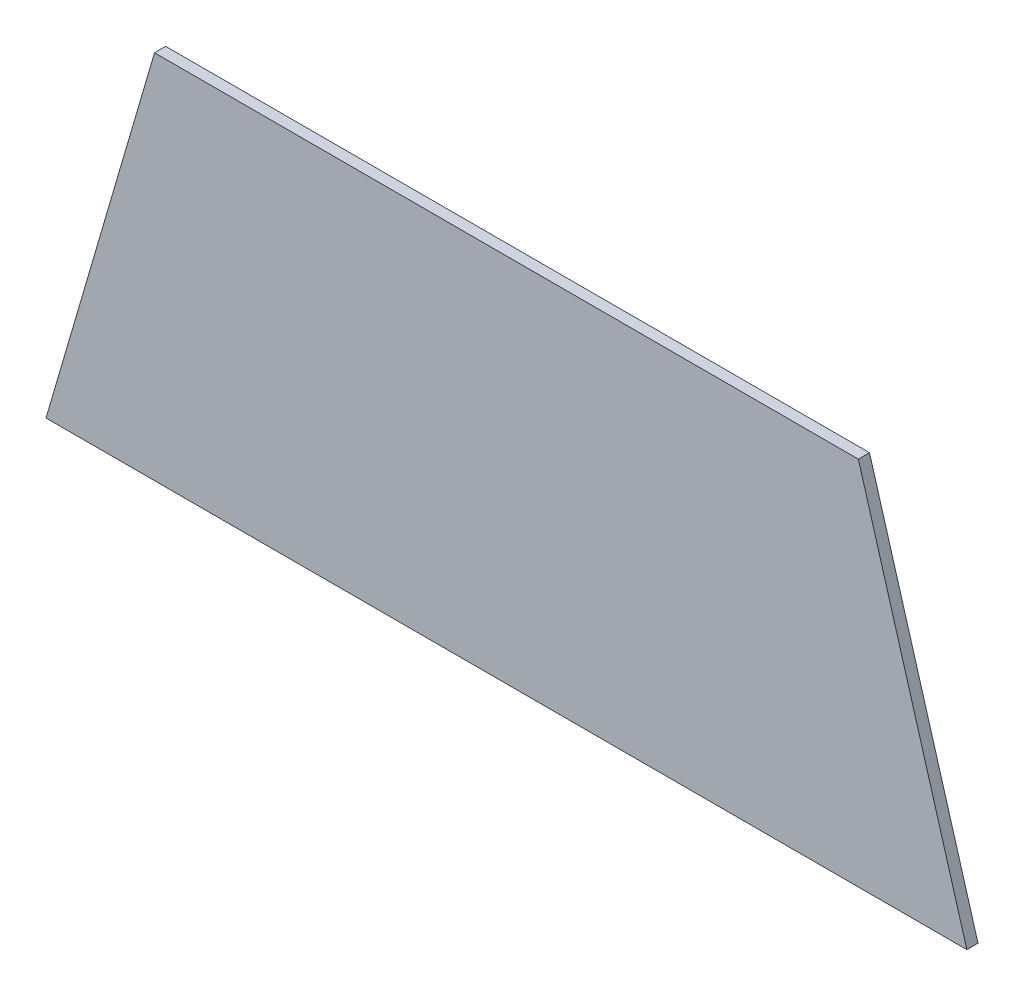
ISO-10303-21;
HEADER;
FILE_DESCRIPTION(('STEP AP214'),'2;1');
FILE_NAME('part.step','',(''),(''),'','','');
FILE_SCHEMA(('AUTOMOTIVE_DESIGN { 1 0 10303 214 1 1 1 1 }'));
ENDSEC;
DATA;
#1=APPLICATION_CONTEXT('core data for automotive mechanical design processes');
#2=APPLICATION_PROTOCOL_DEFINITION('international standard','automotive_design',2000,#1);
#3=PRODUCT_CONTEXT('',#1,'mechanical');
#4=PRODUCT('Part','Part','',(#3));
#5=PRODUCT_RELATED_PRODUCT_CATEGORY('part','',(#4));
#6=PRODUCT_DEFINITION_FORMATION('','',#4);
#7=PRODUCT_DEFINITION_CONTEXT('part definition',#1,'design');
#8=PRODUCT_DEFINITION('design','',#6,#7);
#9=PRODUCT_DEFINITION_SHAPE('','',#8);
#10=(LENGTH_UNIT() NAMED_UNIT(*) SI_UNIT(.MILLI.,.METRE.));
#11=(NAMED_UNIT(*) PLANE_ANGLE_UNIT() SI_UNIT($,.RADIAN.));
#12=(NAMED_UNIT(*) SI_UNIT($,.STERADIAN.) SOLID_ANGLE_UNIT());
#13=UNCERTAINTY_MEASURE_WITH_UNIT(LENGTH_MEASURE(1.E-05),#10,'distance_accuracy_value','');
#14=(GEOMETRIC_REPRESENTATION_CONTEXT(3) GLOBAL_UNCERTAINTY_ASSIGNED_CONTEXT((#13)) GLOBAL_UNIT_ASSIGNED_CONTEXT((#10,
#11,#12)) REPRESENTATION_CONTEXT('',''));
#15=CARTESIAN_POINT('',(0.,0.,0.));
#16=DIRECTION('',(0.,0.,1.));
#17=DIRECTION('',(1.,0.,0.));
#18=AXIS2_PLACEMENT_3D('',#15,#16,#17);
#19=CARTESIAN_POINT('',(-3.5,0.,-0.00672590415549458));
#20=DIRECTION('',(-0.959707262339068,0.281001727065248,0.));
#21=DIRECTION('',(-0.281001727065248,-0.959707262339068,0.));
#22=AXIS2_PLACEMENT_3D('',#19,#20,#21);
#23=PLANE('',#22);
#24=DIRECTION('',(0.,0.,1.));
#25=VECTOR('',#24,1.);
#26=CARTESIAN_POINT('',(-3.5,0.,-0.00672590415549458));
#27=LINE('',#26,#25);
#28=CARTESIAN_POINT('',(-3.5,0.,-0.00672590415549458));
#29=VERTEX_POINT('',#28);
#30=CARTESIAN_POINT('',(-3.5,0.,3.));
#31=VERTEX_POINT('',#30);
#32=EDGE_CURVE('E41',#29,#31,#27,.T.);
#33=ORIENTED_EDGE('',*,*,#32,.T.);
#34=DIRECTION('',(-0.281001727065247,-0.959707262339068,0.));
#35=VECTOR('',#34,1.);
#36=CARTESIAN_POINT('',(-3.5,0.,3.));
#37=LINE('',#36,#35);
#38=CARTESIAN_POINT('',(25.7799417168491,100.,3.));
#39=VERTEX_POINT('',#38);
#40=EDGE_CURVE('E78',#39,#31,#37,.T.);
#41=ORIENTED_EDGE('',*,*,#40,.F.);
#42=DIRECTION('',(0.,0.,1.));
#43=VECTOR('',#42,1.);
#44=CARTESIAN_POINT('',(25.7799417168491,100.,-0.00672590415549458));
#45=LINE('',#44,#43);
#46=CARTESIAN_POINT('',(25.7799417168491,100.,-0.00672590415549458));
#47=VERTEX_POINT('',#46);
#48=EDGE_CURVE('E11',#47,#39,#45,.T.);
#49=ORIENTED_EDGE('',*,*,#48,.F.);
#50=DIRECTION('',(-0.281001727065247,-0.959707262339068,0.));
#51=VECTOR('',#50,1.);
#52=CARTESIAN_POINT('',(-3.5,0.,-0.00672590415549458));
#53=LINE('',#52,#51);
#54=EDGE_CURVE('E79',#47,#29,#53,.T.);
#55=ORIENTED_EDGE('',*,*,#54,.T.);
#56=EDGE_LOOP('',(#33,#41,#49,#55));
#57=FACE_BOUND('',#56,.T.);
#58=ADVANCED_FACE('F38',(#57),#23,.T.);
#59=CARTESIAN_POINT('',(25.7799417168491,100.,-0.00672590415549458));
#60=DIRECTION('',(0.,1.,0.));
#61=DIRECTION('',(0.,0.,1.));
#62=AXIS2_PLACEMENT_3D('',#59,#60,#61);
#63=PLANE('',#62);
#64=ORIENTED_EDGE('',*,*,#48,.T.);
#65=DIRECTION('',(-1.,0.,0.));
#66=VECTOR('',#65,1.);
#67=CARTESIAN_POINT('',(25.7799417168491,100.,3.));
#68=LINE('',#67,#66);
#69=CARTESIAN_POINT('',(215.72005828315,100.,3.));
#70=VERTEX_POINT('',#69);
#71=EDGE_CURVE('E95',#70,#39,#68,.T.);
#72=ORIENTED_EDGE('',*,*,#71,.F.);
#73=DIRECTION('',(0.,0.,1.));
#74=VECTOR('',#73,1.);
#75=CARTESIAN_POINT('',(215.72005828315,100.,-0.00672590415549458));
#76=LINE('',#75,#74);
#77=CARTESIAN_POINT('',(215.72005828315,100.,-0.00672590415549458));
#78=VERTEX_POINT('',#77);
#79=EDGE_CURVE('E46',#78,#70,#76,.T.);
#80=ORIENTED_EDGE('',*,*,#79,.F.);
#81=DIRECTION('',(-1.,0.,0.));
#82=VECTOR('',#81,1.);
#83=CARTESIAN_POINT('',(25.7799417168491,100.,-0.00672590415549458));
#84=LINE('',#83,#82);
#85=EDGE_CURVE('E84',#78,#47,#84,.T.);
#86=ORIENTED_EDGE('',*,*,#85,.T.);
#87=EDGE_LOOP('',(#64,#72,#80,#86));
#88=FACE_BOUND('',#87,.T.);
#89=ADVANCED_FACE('F110',(#88),#63,.T.);
#90=CARTESIAN_POINT('',(245.,0.,-0.00672590415549458));
#91=DIRECTION('',(0.959707262339066,0.281001727065255,0.));
#92=DIRECTION('',(-0.281001727065255,0.959707262339066,0.));
#93=AXIS2_PLACEMENT_3D('',#90,#91,#92);
#94=PLANE('',#93);
#95=ORIENTED_EDGE('',*,*,#79,.T.);
#96=DIRECTION('',(-0.281001727065255,0.959707262339066,0.));
#97=VECTOR('',#96,1.);
#98=CARTESIAN_POINT('',(245.,0.,3.));
#99=LINE('',#98,#97);
#100=CARTESIAN_POINT('',(245.,0.,3.));
#101=VERTEX_POINT('',#100);
#102=EDGE_CURVE('E91',#101,#70,#99,.T.);
#103=ORIENTED_EDGE('',*,*,#102,.F.);
#104=DIRECTION('',(0.,0.,1.));
#105=VECTOR('',#104,1.);
#106=CARTESIAN_POINT('',(245.,0.,-0.00672590415549458));
#107=LINE('',#106,#105);
#108=CARTESIAN_POINT('',(245.,0.,-0.00672590415549458));
#109=VERTEX_POINT('',#108);
#110=EDGE_CURVE('E83',#109,#101,#107,.T.);
#111=ORIENTED_EDGE('',*,*,#110,.F.);
#112=DIRECTION('',(-0.281001727065255,0.959707262339066,0.));
#113=VECTOR('',#112,1.);
#114=CARTESIAN_POINT('',(245.,0.,-0.00672590415549458));
#115=LINE('',#114,#113);
#116=EDGE_CURVE('E103',#109,#78,#115,.T.);
#117=ORIENTED_EDGE('',*,*,#116,.T.);
#118=EDGE_LOOP('',(#95,#103,#111,#117));
#119=FACE_BOUND('',#118,.T.);
#120=ADVANCED_FACE('F107',(#119),#94,.T.);
#121=CARTESIAN_POINT('',(-3.5,0.,-0.00672590415549458));
#122=DIRECTION('',(0.,-1.,0.));
#123=DIRECTION('',(0.,0.,-1.));
#124=AXIS2_PLACEMENT_3D('',#121,#122,#123);
#125=PLANE('',#124);
#126=ORIENTED_EDGE('',*,*,#110,.T.);
#127=DIRECTION('',(1.,0.,0.));
#128=VECTOR('',#127,1.);
#129=CARTESIAN_POINT('',(-3.5,0.,3.));
#130=LINE('',#129,#128);
#131=EDGE_CURVE('E86',#31,#101,#130,.T.);
#132=ORIENTED_EDGE('',*,*,#131,.F.);
#133=ORIENTED_EDGE('',*,*,#32,.F.);
#134=DIRECTION('',(1.,0.,0.));
#135=VECTOR('',#134,1.);
#136=CARTESIAN_POINT('',(-3.5,0.,-0.00672590415549458));
#137=LINE('',#136,#135);
#138=EDGE_CURVE('E101',#29,#109,#137,.T.);
#139=ORIENTED_EDGE('',*,*,#138,.T.);
#140=EDGE_LOOP('',(#126,#132,#133,#139));
#141=FACE_BOUND('',#140,.T.);
#142=ADVANCED_FACE('F87',(#141),#125,.T.);
#143=CARTESIAN_POINT('',(0.,0.,-0.00672590415549458));
#144=DIRECTION('',(0.,0.,-1.));
#145=DIRECTION('',(-1.,0.,0.));
#146=AXIS2_PLACEMENT_3D('',#143,#144,#145);
#147=PLANE('',#146);
#148=ORIENTED_EDGE('',*,*,#54,.F.);
#149=ORIENTED_EDGE('',*,*,#85,.F.);
#150=ORIENTED_EDGE('',*,*,#116,.F.);
#151=ORIENTED_EDGE('',*,*,#138,.F.);
#152=EDGE_LOOP('',(#148,#149,#150,#151));
#153=FACE_BOUND('',#152,.T.);
#154=ADVANCED_FACE('F112',(#153),#147,.T.);
#155=CARTESIAN_POINT('',(0.,0.,3.));
#156=DIRECTION('',(0.,0.,-1.));
#157=DIRECTION('',(-1.,0.,0.));
#158=AXIS2_PLACEMENT_3D('',#155,#156,#157);
#159=PLANE('',#158);
#160=ORIENTED_EDGE('',*,*,#40,.T.);
#161=ORIENTED_EDGE('',*,*,#131,.T.);
#162=ORIENTED_EDGE('',*,*,#102,.T.);
#163=ORIENTED_EDGE('',*,*,#71,.T.);
#164=EDGE_LOOP('',(#160,#161,#162,#163));
#165=FACE_BOUND('',#164,.T.);
#166=ADVANCED_FACE('F94',(#165),#159,.F.);
#167=CLOSED_SHELL('',(#58,#89,#120,#142,#154,#166));
#168=MANIFOLD_SOLID_BREP('B2',#167);
#169=ADVANCED_BREP_SHAPE_REPRESENTATION('',(#18,#168),#14);
#170=SHAPE_DEFINITION_REPRESENTATION(#9,#169);
ENDSEC;
END-ISO-10303-21;
